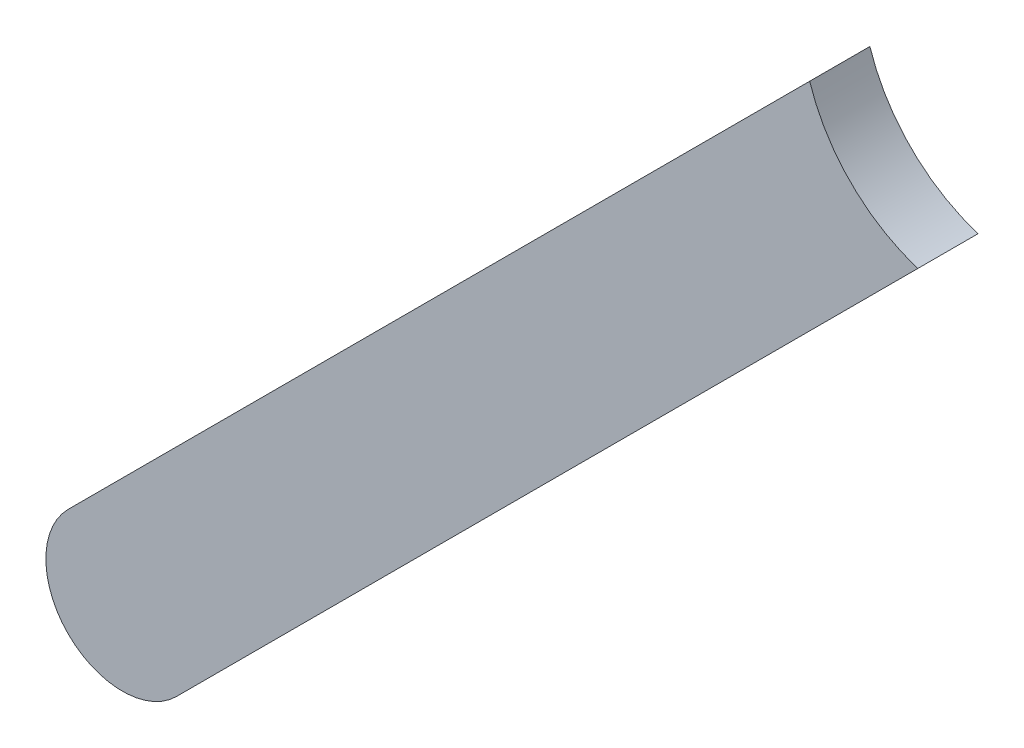
ISO-10303-21;
HEADER;
FILE_DESCRIPTION(('STEP AP214'),'2;1');
FILE_NAME('part.step','',(''),(''),'','','');
FILE_SCHEMA(('AUTOMOTIVE_DESIGN { 1 0 10303 214 1 1 1 1 }'));
ENDSEC;
DATA;
#1=APPLICATION_CONTEXT('core data for automotive mechanical design processes');
#2=APPLICATION_PROTOCOL_DEFINITION('international standard','automotive_design',2000,#1);
#3=PRODUCT_CONTEXT('',#1,'mechanical');
#4=PRODUCT('Part','Part','',(#3));
#5=PRODUCT_RELATED_PRODUCT_CATEGORY('part','',(#4));
#6=PRODUCT_DEFINITION_FORMATION('','',#4);
#7=PRODUCT_DEFINITION_CONTEXT('part definition',#1,'design');
#8=PRODUCT_DEFINITION('design','',#6,#7);
#9=PRODUCT_DEFINITION_SHAPE('','',#8);
#10=(LENGTH_UNIT() NAMED_UNIT(*) SI_UNIT(.MILLI.,.METRE.));
#11=(NAMED_UNIT(*) PLANE_ANGLE_UNIT() SI_UNIT($,.RADIAN.));
#12=(NAMED_UNIT(*) SI_UNIT($,.STERADIAN.) SOLID_ANGLE_UNIT());
#13=UNCERTAINTY_MEASURE_WITH_UNIT(LENGTH_MEASURE(1.E-05),#10,'distance_accuracy_value','');
#14=(GEOMETRIC_REPRESENTATION_CONTEXT(3) GLOBAL_UNCERTAINTY_ASSIGNED_CONTEXT((#13)) GLOBAL_UNIT_ASSIGNED_CONTEXT((#10,
#11,#12)) REPRESENTATION_CONTEXT('',''));
#15=CARTESIAN_POINT('',(0.,0.,0.));
#16=DIRECTION('',(0.,0.,1.));
#17=DIRECTION('',(1.,0.,0.));
#18=AXIS2_PLACEMENT_3D('',#15,#16,#17);
#19=CARTESIAN_POINT('',(126.39220594,88.06725846,0.));
#20=DIRECTION('',(-0.707106781186548,0.707106781186548,0.));
#21=DIRECTION('',(0.707106781186548,0.707106781186548,0.));
#22=AXIS2_PLACEMENT_3D('',#19,#20,#21);
#23=PLANE('',#22);
#24=DIRECTION('',(0.707106781186548,0.707106781186548,0.));
#25=VECTOR('',#24,1.);
#26=CARTESIAN_POINT('',(126.39220594,88.06725846,0.1999996));
#27=LINE('',#26,#25);
#28=CARTESIAN_POINT('',(126.39220594,88.06725846,0.1999996));
#29=VERTEX_POINT('',#28);
#30=CARTESIAN_POINT('',(128.855408458856,90.5304609788559,0.1999996));
#31=VERTEX_POINT('',#30);
#32=EDGE_CURVE('E11',#29,#31,#27,.T.);
#33=ORIENTED_EDGE('',*,*,#32,.F.);
#34=DIRECTION('',(0.,0.,1.));
#35=VECTOR('',#34,1.);
#36=CARTESIAN_POINT('',(126.39220594,88.06725846,0.));
#37=LINE('',#36,#35);
#38=CARTESIAN_POINT('',(126.39220594,88.06725846,0.));
#39=VERTEX_POINT('',#38);
#40=EDGE_CURVE('E24',#39,#29,#37,.T.);
#41=ORIENTED_EDGE('',*,*,#40,.F.);
#42=DIRECTION('',(0.707106781186548,0.707106781186548,0.));
#43=VECTOR('',#42,1.);
#44=CARTESIAN_POINT('',(126.39220594,88.06725846,0.));
#45=LINE('',#44,#43);
#46=CARTESIAN_POINT('',(128.855408458856,90.5304609788559,0.));
#47=VERTEX_POINT('',#46);
#48=EDGE_CURVE('E75',#39,#47,#45,.T.);
#49=ORIENTED_EDGE('',*,*,#48,.T.);
#50=DIRECTION('',(0.,0.,1.));
#51=VECTOR('',#50,1.);
#52=CARTESIAN_POINT('',(128.855408458856,90.5304609788559,0.));
#53=LINE('',#52,#51);
#54=EDGE_CURVE('E37',#47,#31,#53,.T.);
#55=ORIENTED_EDGE('',*,*,#54,.T.);
#56=EDGE_LOOP('',(#33,#41,#49,#55));
#57=FACE_BOUND('',#56,.T.);
#58=ADVANCED_FACE('F17',(#57),#23,.F.);
#59=CARTESIAN_POINT('',(129.0247356,91.059,0.));
#60=DIRECTION('',(0.,0.,-1.));
#61=DIRECTION('',(1.,0.,0.));
#62=AXIS2_PLACEMENT_3D('',#59,#60,#61);
#63=CYLINDRICAL_SURFACE('',#62,0.55500016);
#64=DIRECTION('',(0.,0.,1.));
#65=VECTOR('',#64,1.);
#66=CARTESIAN_POINT('',(128.496196578856,90.8896728588559,0.));
#67=LINE('',#66,#65);
#68=CARTESIAN_POINT('',(128.496196578856,90.8896728588559,0.));
#69=VERTEX_POINT('',#68);
#70=CARTESIAN_POINT('',(128.496196578856,90.8896728588559,0.1999996));
#71=VERTEX_POINT('',#70);
#72=EDGE_CURVE('E67',#69,#71,#67,.T.);
#73=ORIENTED_EDGE('',*,*,#72,.T.);
#74=CARTESIAN_POINT('',(129.0247356,91.059,0.1999996));
#75=DIRECTION('',(0.,0.,1.));
#76=DIRECTION('',(1.,0.,0.));
#77=AXIS2_PLACEMENT_3D('',#74,#75,#76);
#78=CIRCLE('',#77,0.55500016);
#79=EDGE_CURVE('E82',#71,#31,#78,.T.);
#80=ORIENTED_EDGE('',*,*,#79,.T.);
#81=ORIENTED_EDGE('',*,*,#54,.F.);
#82=CARTESIAN_POINT('',(129.0247356,91.059,0.));
#83=DIRECTION('',(0.,0.,1.));
#84=DIRECTION('',(1.,0.,0.));
#85=AXIS2_PLACEMENT_3D('',#82,#83,#84);
#86=CIRCLE('',#85,0.55500016);
#87=EDGE_CURVE('E80',#69,#47,#86,.T.);
#88=ORIENTED_EDGE('',*,*,#87,.F.);
#89=EDGE_LOOP('',(#73,#80,#81,#88));
#90=FACE_BOUND('',#89,.T.);
#91=ADVANCED_FACE('F88',(#90),#63,.F.);
#92=CARTESIAN_POINT('',(128.496196578856,90.8896728588559,0.));
#93=DIRECTION('',(0.707106781186544,-0.707106781186551,0.));
#94=DIRECTION('',(-0.707106781186551,-0.707106781186544,0.));
#95=AXIS2_PLACEMENT_3D('',#92,#93,#94);
#96=PLANE('',#95);
#97=DIRECTION('',(-0.707106781186551,-0.707106781186544,0.));
#98=VECTOR('',#97,1.);
#99=CARTESIAN_POINT('',(128.84512966,91.23860594,0.1999996));
#100=LINE('',#99,#98);
#101=CARTESIAN_POINT('',(126.03299406,88.42647034,0.1999996));
#102=VERTEX_POINT('',#101);
#103=EDGE_CURVE('E71',#71,#102,#100,.T.);
#104=ORIENTED_EDGE('',*,*,#103,.F.);
#105=ORIENTED_EDGE('',*,*,#72,.F.);
#106=DIRECTION('',(-0.707106781186551,-0.707106781186544,0.));
#107=VECTOR('',#106,1.);
#108=CARTESIAN_POINT('',(128.84512966,91.23860594,0.));
#109=LINE('',#108,#107);
#110=CARTESIAN_POINT('',(126.03299406,88.42647034,0.));
#111=VERTEX_POINT('',#110);
#112=EDGE_CURVE('E63',#69,#111,#109,.T.);
#113=ORIENTED_EDGE('',*,*,#112,.T.);
#114=DIRECTION('',(0.,0.,1.));
#115=VECTOR('',#114,1.);
#116=CARTESIAN_POINT('',(126.03299406,88.42647034,0.));
#117=LINE('',#116,#115);
#118=EDGE_CURVE('E53',#111,#102,#117,.T.);
#119=ORIENTED_EDGE('',*,*,#118,.T.);
#120=EDGE_LOOP('',(#104,#105,#113,#119));
#121=FACE_BOUND('',#120,.T.);
#122=ADVANCED_FACE('F66',(#121),#96,.F.);
#123=CARTESIAN_POINT('',(126.2126,88.2468644,0.));
#124=DIRECTION('',(0.,0.,-1.));
#125=DIRECTION('',(-0.707106781186548,0.707106781186548,0.));
#126=AXIS2_PLACEMENT_3D('',#123,#124,#125);
#127=CYLINDRICAL_SURFACE('',#126,0.254001156230774);
#128=CARTESIAN_POINT('',(126.2126,88.2468644,0.1999996));
#129=DIRECTION('',(0.,0.,1.));
#130=DIRECTION('',(-0.707106781186548,0.707106781186548,0.));
#131=AXIS2_PLACEMENT_3D('',#128,#129,#130);
#132=CIRCLE('',#131,0.254001156230774);
#133=EDGE_CURVE('E59',#102,#29,#132,.T.);
#134=ORIENTED_EDGE('',*,*,#133,.F.);
#135=ORIENTED_EDGE('',*,*,#118,.F.);
#136=CARTESIAN_POINT('',(126.2126,88.2468644,0.));
#137=DIRECTION('',(0.,0.,1.));
#138=DIRECTION('',(-0.707106781186548,0.707106781186548,0.));
#139=AXIS2_PLACEMENT_3D('',#136,#137,#138);
#140=CIRCLE('',#139,0.254001156230774);
#141=EDGE_CURVE('E57',#111,#39,#140,.T.);
#142=ORIENTED_EDGE('',*,*,#141,.T.);
#143=ORIENTED_EDGE('',*,*,#40,.T.);
#144=EDGE_LOOP('',(#134,#135,#142,#143));
#145=FACE_BOUND('',#144,.T.);
#146=ADVANCED_FACE('F55',(#145),#127,.T.);
#147=CARTESIAN_POINT('',(126.39220594,88.06725846,0.));
#148=DIRECTION('',(0.,0.,-1.));
#149=DIRECTION('',(-1.,0.,0.));
#150=AXIS2_PLACEMENT_3D('',#147,#148,#149);
#151=PLANE('',#150);
#152=ORIENTED_EDGE('',*,*,#48,.F.);
#153=ORIENTED_EDGE('',*,*,#141,.F.);
#154=ORIENTED_EDGE('',*,*,#112,.F.);
#155=ORIENTED_EDGE('',*,*,#87,.T.);
#156=EDGE_LOOP('',(#152,#153,#154,#155));
#157=FACE_BOUND('',#156,.T.);
#158=ADVANCED_FACE('F74',(#157),#151,.T.);
#159=CARTESIAN_POINT('',(126.39220594,88.06725846,0.1999996));
#160=DIRECTION('',(0.,0.,-1.));
#161=DIRECTION('',(-1.,0.,0.));
#162=AXIS2_PLACEMENT_3D('',#159,#160,#161);
#163=PLANE('',#162);
#164=ORIENTED_EDGE('',*,*,#133,.T.);
#165=ORIENTED_EDGE('',*,*,#32,.T.);
#166=ORIENTED_EDGE('',*,*,#79,.F.);
#167=ORIENTED_EDGE('',*,*,#103,.T.);
#168=EDGE_LOOP('',(#164,#165,#166,#167));
#169=FACE_BOUND('',#168,.T.);
#170=ADVANCED_FACE('F91',(#169),#163,.F.);
#171=CLOSED_SHELL('',(#58,#91,#122,#146,#158,#170));
#172=MANIFOLD_SOLID_BREP('B1',#171);
#173=ADVANCED_BREP_SHAPE_REPRESENTATION('',(#18,#172),#14);
#174=SHAPE_DEFINITION_REPRESENTATION(#9,#173);
ENDSEC;
END-ISO-10303-21;
